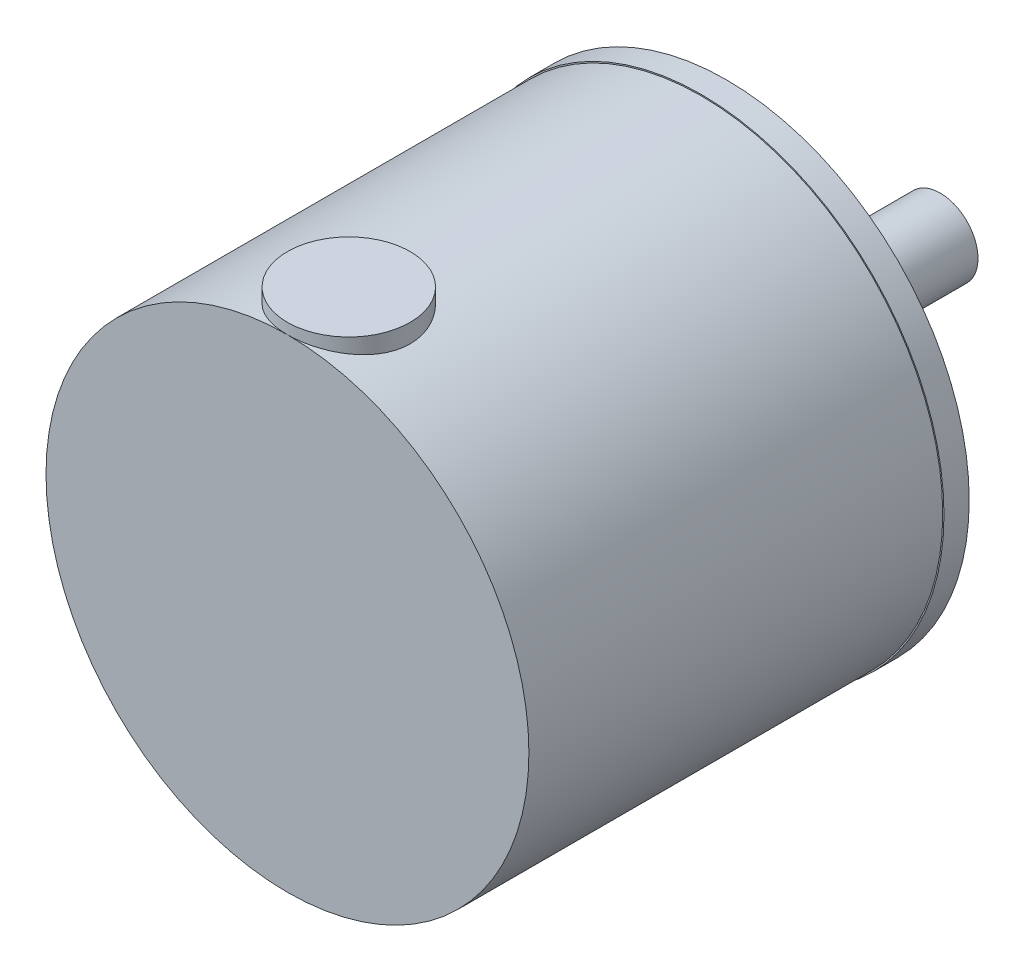
ISO-10303-21;
HEADER;
FILE_DESCRIPTION(('STEP AP214'),'2;1');
FILE_NAME('part.step','',(''),(''),'','','');
FILE_SCHEMA(('AUTOMOTIVE_DESIGN { 1 0 10303 214 1 1 1 1 }'));
ENDSEC;
DATA;
#1=APPLICATION_CONTEXT('core data for automotive mechanical design processes');
#2=APPLICATION_PROTOCOL_DEFINITION('international standard','automotive_design',2000,#1);
#3=PRODUCT_CONTEXT('',#1,'mechanical');
#4=PRODUCT('Part','Part','',(#3));
#5=PRODUCT_RELATED_PRODUCT_CATEGORY('part','',(#4));
#6=PRODUCT_DEFINITION_FORMATION('','',#4);
#7=PRODUCT_DEFINITION_CONTEXT('part definition',#1,'design');
#8=PRODUCT_DEFINITION('design','',#6,#7);
#9=PRODUCT_DEFINITION_SHAPE('','',#8);
#10=(LENGTH_UNIT() NAMED_UNIT(*) SI_UNIT(.MILLI.,.METRE.));
#11=(NAMED_UNIT(*) PLANE_ANGLE_UNIT() SI_UNIT($,.RADIAN.));
#12=(NAMED_UNIT(*) SI_UNIT($,.STERADIAN.) SOLID_ANGLE_UNIT());
#13=UNCERTAINTY_MEASURE_WITH_UNIT(LENGTH_MEASURE(1.E-05),#10,'distance_accuracy_value','');
#14=(GEOMETRIC_REPRESENTATION_CONTEXT(3) GLOBAL_UNCERTAINTY_ASSIGNED_CONTEXT((#13)) GLOBAL_UNIT_ASSIGNED_CONTEXT((#10,
#11,#12)) REPRESENTATION_CONTEXT('',''));
#15=CARTESIAN_POINT('',(0.,0.,0.));
#16=DIRECTION('',(0.,0.,1.));
#17=DIRECTION('',(1.,0.,0.));
#18=AXIS2_PLACEMENT_3D('',#15,#16,#17);
#19=CARTESIAN_POINT('',(0.,0.,0.));
#20=DIRECTION('',(0.,0.,1.));
#21=DIRECTION('',(1.,0.,0.));
#22=AXIS2_PLACEMENT_3D('',#19,#20,#21);
#23=PLANE('',#22);
#24=CARTESIAN_POINT('',(-13.6123028617707,4.79984834476713,0.));
#25=DIRECTION('',(0.,0.,-1.));
#26=DIRECTION('',(-1.,0.,0.));
#27=AXIS2_PLACEMENT_3D('',#24,#25,#26);
#28=CIRCLE('',#27,1.5);
#29=CARTESIAN_POINT('',(-15.1123028617707,4.79984834476713,0.));
#30=VERTEX_POINT('',#29);
#31=EDGE_CURVE('E140',#30,#30,#28,.T.);
#32=ORIENTED_EDGE('',*,*,#31,.F.);
#33=EDGE_LOOP('',(#32));
#34=FACE_BOUND('',#33,.T.);
#35=CARTESIAN_POINT('',(2.6493608300043,-14.1885242546846,0.));
#36=DIRECTION('',(0.,0.,-1.));
#37=DIRECTION('',(-1.,0.,0.));
#38=AXIS2_PLACEMENT_3D('',#35,#36,#37);
#39=CIRCLE('',#38,1.5);
#40=CARTESIAN_POINT('',(1.1493608300043,-14.1885242546846,0.));
#41=VERTEX_POINT('',#40);
#42=EDGE_CURVE('E144',#41,#41,#39,.T.);
#43=ORIENTED_EDGE('',*,*,#42,.F.);
#44=EDGE_LOOP('',(#43));
#45=FACE_BOUND('',#44,.T.);
#46=CARTESIAN_POINT('',(10.9629420317664,9.38867590991743,0.));
#47=DIRECTION('',(0.,0.,-1.));
#48=DIRECTION('',(-1.,0.,0.));
#49=AXIS2_PLACEMENT_3D('',#46,#47,#48);
#50=CIRCLE('',#49,1.5);
#51=CARTESIAN_POINT('',(9.46294203176636,9.38867590991743,0.));
#52=VERTEX_POINT('',#51);
#53=EDGE_CURVE('E148',#52,#52,#50,.T.);
#54=ORIENTED_EDGE('',*,*,#53,.F.);
#55=EDGE_LOOP('',(#54));
#56=FACE_BOUND('',#55,.T.);
#57=CARTESIAN_POINT('',(0.,0.,0.));
#58=DIRECTION('',(0.,0.,-1.));
#59=DIRECTION('',(-1.,0.,0.));
#60=AXIS2_PLACEMENT_3D('',#57,#58,#59);
#61=CIRCLE('',#60,9.975);
#62=CARTESIAN_POINT('',(9.975,0.,0.));
#63=VERTEX_POINT('',#62);
#64=EDGE_CURVE('E49',#63,#63,#61,.T.);
#65=ORIENTED_EDGE('',*,*,#64,.F.);
#66=EDGE_LOOP('',(#65));
#67=FACE_BOUND('',#66,.T.);
#68=CARTESIAN_POINT('',(0.,0.,0.));
#69=DIRECTION('',(0.,0.,-1.));
#70=DIRECTION('',(-1.,0.,0.));
#71=AXIS2_PLACEMENT_3D('',#68,#69,#70);
#72=CIRCLE('',#71,19.25);
#73=CARTESIAN_POINT('',(-19.25,0.,0.));
#74=VERTEX_POINT('',#73);
#75=EDGE_CURVE('E153',#74,#74,#72,.T.);
#76=ORIENTED_EDGE('',*,*,#75,.T.);
#77=EDGE_LOOP('',(#76));
#78=FACE_BOUND('',#77,.T.);
#79=ADVANCED_FACE('F40',(#34,#45,#56,#67,#78),#23,.F.);
#80=CARTESIAN_POINT('',(0.,0.,-4.95));
#81=DIRECTION('',(0.,0.,1.));
#82=DIRECTION('',(1.,0.,0.));
#83=AXIS2_PLACEMENT_3D('',#80,#81,#82);
#84=CYLINDRICAL_SURFACE('',#83,9.975);
#85=CARTESIAN_POINT('',(0.,0.,-4.95));
#86=DIRECTION('',(0.,0.,-1.));
#87=DIRECTION('',(-1.,0.,0.));
#88=AXIS2_PLACEMENT_3D('',#85,#86,#87);
#89=CIRCLE('',#88,9.975);
#90=CARTESIAN_POINT('',(9.975,0.,-4.95));
#91=VERTEX_POINT('',#90);
#92=EDGE_CURVE('E80',#91,#91,#89,.T.);
#93=CARTESIAN_POINT('',(9.975,0.,-4.95));
#94=CARTESIAN_POINT('',(9.975,0.,-4.8984375));
#95=CARTESIAN_POINT('',(9.975,0.,-4.846875));
#96=CARTESIAN_POINT('',(9.975,0.,-4.74375));
#97=CARTESIAN_POINT('',(9.975,0.,-4.6921875));
#98=CARTESIAN_POINT('',(9.975,0.,-4.5890625));
#99=CARTESIAN_POINT('',(9.975,0.,-4.5375));
#100=CARTESIAN_POINT('',(9.975,0.,-4.434375));
#101=CARTESIAN_POINT('',(9.975,0.,-4.3828125));
#102=CARTESIAN_POINT('',(9.975,0.,-4.2796875));
#103=CARTESIAN_POINT('',(9.975,0.,-4.228125));
#104=CARTESIAN_POINT('',(9.975,0.,-4.125));
#105=CARTESIAN_POINT('',(9.975,0.,-4.0734375));
#106=CARTESIAN_POINT('',(9.975,0.,-3.9703125));
#107=CARTESIAN_POINT('',(9.975,0.,-3.91875));
#108=CARTESIAN_POINT('',(9.975,0.,-3.815625));
#109=CARTESIAN_POINT('',(9.975,0.,-3.7640625));
#110=CARTESIAN_POINT('',(9.975,0.,-3.6609375));
#111=CARTESIAN_POINT('',(9.975,0.,-3.609375));
#112=CARTESIAN_POINT('',(9.975,0.,-3.50625));
#113=CARTESIAN_POINT('',(9.975,0.,-3.4546875));
#114=CARTESIAN_POINT('',(9.975,0.,-3.3515625));
#115=CARTESIAN_POINT('',(9.975,0.,-3.3));
#116=CARTESIAN_POINT('',(9.975,0.,-3.196875));
#117=CARTESIAN_POINT('',(9.975,0.,-3.1453125));
#118=CARTESIAN_POINT('',(9.975,0.,-3.0421875));
#119=CARTESIAN_POINT('',(9.975,0.,-2.990625));
#120=CARTESIAN_POINT('',(9.975,0.,-2.8875));
#121=CARTESIAN_POINT('',(9.975,0.,-2.8359375));
#122=CARTESIAN_POINT('',(9.975,0.,-2.7328125));
#123=CARTESIAN_POINT('',(9.975,0.,-2.68125));
#124=CARTESIAN_POINT('',(9.975,0.,-2.578125));
#125=CARTESIAN_POINT('',(9.975,0.,-2.5265625));
#126=CARTESIAN_POINT('',(9.975,0.,-2.4234375));
#127=CARTESIAN_POINT('',(9.975,0.,-2.371875));
#128=CARTESIAN_POINT('',(9.975,0.,-2.26875));
#129=CARTESIAN_POINT('',(9.975,0.,-2.2171875));
#130=CARTESIAN_POINT('',(9.975,0.,-2.1140625));
#131=CARTESIAN_POINT('',(9.975,0.,-2.0625));
#132=CARTESIAN_POINT('',(9.975,0.,-1.959375));
#133=CARTESIAN_POINT('',(9.975,0.,-1.9078125));
#134=CARTESIAN_POINT('',(9.975,0.,-1.8046875));
#135=CARTESIAN_POINT('',(9.975,0.,-1.753125));
#136=CARTESIAN_POINT('',(9.975,0.,-1.65));
#137=CARTESIAN_POINT('',(9.975,0.,-1.5984375));
#138=CARTESIAN_POINT('',(9.975,0.,-1.4953125));
#139=CARTESIAN_POINT('',(9.975,0.,-1.44375));
#140=CARTESIAN_POINT('',(9.975,0.,-1.340625));
#141=CARTESIAN_POINT('',(9.975,0.,-1.2890625));
#142=CARTESIAN_POINT('',(9.975,0.,-1.1859375));
#143=CARTESIAN_POINT('',(9.975,0.,-1.134375));
#144=CARTESIAN_POINT('',(9.975,0.,-1.03125));
#145=CARTESIAN_POINT('',(9.975,0.,-0.9796875));
#146=CARTESIAN_POINT('',(9.975,0.,-0.8765625));
#147=CARTESIAN_POINT('',(9.975,0.,-0.825));
#148=CARTESIAN_POINT('',(9.975,0.,-0.721875));
#149=CARTESIAN_POINT('',(9.975,0.,-0.6703125));
#150=CARTESIAN_POINT('',(9.975,0.,-0.5671875));
#151=CARTESIAN_POINT('',(9.975,0.,-0.515625));
#152=CARTESIAN_POINT('',(9.975,0.,-0.4125));
#153=CARTESIAN_POINT('',(9.975,0.,-0.3609375));
#154=CARTESIAN_POINT('',(9.975,0.,-0.2578125));
#155=CARTESIAN_POINT('',(9.975,0.,-0.20625));
#156=CARTESIAN_POINT('',(9.975,0.,-0.103125));
#157=CARTESIAN_POINT('',(9.975,0.,-0.0515625000000001));
#158=CARTESIAN_POINT('',(9.975,0.,0.));
#159=B_SPLINE_CURVE_WITH_KNOTS('',3,(#93,#94,#95,#96,#97,#98,#99,#100,#101,#102,#103,#104,#105,
#106,#107,#108,#109,#110,#111,#112,#113,#114,#115,#116,#117,#118,#119,#120,#121,#122,#123,#124,
#125,#126,#127,#128,#129,#130,#131,#132,#133,#134,#135,#136,#137,#138,#139,#140,#141,#142,#143,
#144,#145,#146,#147,#148,#149,#150,#151,#152,#153,#154,#155,#156,#157,#158),.UNSPECIFIED.,.F.,
.F.,(4,2,2,2,2,2,2,2,2,2,2,2,2,2,2,2,2,2,2,2,2,2,2,2,2,2,2,2,2,2,2,2,4),(0.,0.1546875,
0.309375000000001,0.4640625,0.61875,0.773437500000001,0.928125000000001,1.0828125,1.2375,
1.3921875,1.546875,1.7015625,1.85625,2.0109375,2.165625,2.3203125,2.475,2.6296875,2.784375,
2.9390625,3.09375,3.2484375,3.403125,3.5578125,3.7125,3.8671875,4.021875,4.1765625,4.33125,
4.4859375,4.640625,4.7953125,4.95),.UNSPECIFIED.);
#160=EDGE_CURVE('BSEAM127',#91,#63,#159,.T.);
#161=ORIENTED_EDGE('',*,*,#92,.F.);
#162=ORIENTED_EDGE('',*,*,#64,.T.);
#163=ORIENTED_EDGE('',*,*,#160,.T.);
#164=ORIENTED_EDGE('',*,*,#160,.F.);
#165=EDGE_LOOP('',(#161,#163,#162,#164));
#166=FACE_BOUND('',#165,.T.);
#167=ADVANCED_FACE('F127',(#166),#84,.T.);
#168=CARTESIAN_POINT('',(0.,0.,-4.95));
#169=DIRECTION('',(0.,0.,-1.));
#170=DIRECTION('',(-1.,0.,0.));
#171=AXIS2_PLACEMENT_3D('',#168,#169,#170);
#172=PLANE('',#171);
#173=CARTESIAN_POINT('',(0.,0.,-4.95));
#174=DIRECTION('',(0.,0.,-1.));
#175=DIRECTION('',(-1.,0.,0.));
#176=AXIS2_PLACEMENT_3D('',#173,#174,#175);
#177=CIRCLE('',#176,3.);
#178=CARTESIAN_POINT('',(-1.83932052671632,-2.37,-4.95));
#179=VERTEX_POINT('',#178);
#180=CARTESIAN_POINT('',(1.83932052671632,-2.37,-4.95));
#181=VERTEX_POINT('',#180);
#182=EDGE_CURVE('E70',#179,#181,#177,.T.);
#183=ORIENTED_EDGE('',*,*,#182,.F.);
#184=DIRECTION('',(-1.,0.,0.));
#185=VECTOR('',#184,1.);
#186=CARTESIAN_POINT('',(1.83932052671632,-2.37,-4.95));
#187=LINE('',#186,#185);
#188=EDGE_CURVE('E55',#181,#179,#187,.T.);
#189=ORIENTED_EDGE('',*,*,#188,.F.);
#190=EDGE_LOOP('',(#183,#189));
#191=FACE_BOUND('',#190,.T.);
#192=ORIENTED_EDGE('',*,*,#92,.T.);
#193=EDGE_LOOP('',(#192));
#194=FACE_BOUND('',#193,.T.);
#195=ADVANCED_FACE('F123',(#191,#194),#172,.T.);
#196=CARTESIAN_POINT('',(0.,0.,-16.95));
#197=DIRECTION('',(0.,0.,1.));
#198=DIRECTION('',(1.,0.,0.));
#199=AXIS2_PLACEMENT_3D('',#196,#197,#198);
#200=CYLINDRICAL_SURFACE('',#199,3.);
#201=ORIENTED_EDGE('',*,*,#182,.T.);
#202=DIRECTION('',(0.,0.,1.));
#203=VECTOR('',#202,1.);
#204=CARTESIAN_POINT('',(1.83932052671632,-2.37,-16.95));
#205=LINE('',#204,#203);
#206=CARTESIAN_POINT('',(1.83932052671632,-2.37,-16.95));
#207=VERTEX_POINT('',#206);
#208=EDGE_CURVE('E84',#207,#181,#205,.T.);
#209=ORIENTED_EDGE('',*,*,#208,.F.);
#210=CARTESIAN_POINT('',(0.,0.,-16.95));
#211=DIRECTION('',(0.,0.,-1.));
#212=DIRECTION('',(-1.,0.,0.));
#213=AXIS2_PLACEMENT_3D('',#210,#211,#212);
#214=CIRCLE('',#213,3.);
#215=CARTESIAN_POINT('',(-1.83932052671632,-2.37,-16.95));
#216=VERTEX_POINT('',#215);
#217=EDGE_CURVE('E92',#216,#207,#214,.T.);
#218=ORIENTED_EDGE('',*,*,#217,.F.);
#219=DIRECTION('',(0.,0.,1.));
#220=VECTOR('',#219,1.);
#221=CARTESIAN_POINT('',(-1.83932052671632,-2.37,-16.95));
#222=LINE('',#221,#220);
#223=EDGE_CURVE('E88',#216,#179,#222,.T.);
#224=ORIENTED_EDGE('',*,*,#223,.T.);
#225=EDGE_LOOP('',(#201,#209,#218,#224));
#226=FACE_BOUND('',#225,.T.);
#227=ADVANCED_FACE('F119',(#226),#200,.T.);
#228=CARTESIAN_POINT('',(1.83932052671632,-2.37,-16.95));
#229=DIRECTION('',(0.,1.,0.));
#230=DIRECTION('',(-1.,0.,0.));
#231=AXIS2_PLACEMENT_3D('',#228,#229,#230);
#232=PLANE('',#231);
#233=ORIENTED_EDGE('',*,*,#188,.T.);
#234=ORIENTED_EDGE('',*,*,#223,.F.);
#235=DIRECTION('',(-1.,0.,0.));
#236=VECTOR('',#235,1.);
#237=CARTESIAN_POINT('',(1.83932052671632,-2.37,-16.95));
#238=LINE('',#237,#236);
#239=EDGE_CURVE('E63',#207,#216,#238,.T.);
#240=ORIENTED_EDGE('',*,*,#239,.F.);
#241=ORIENTED_EDGE('',*,*,#208,.T.);
#242=EDGE_LOOP('',(#233,#234,#240,#241));
#243=FACE_BOUND('',#242,.T.);
#244=ADVANCED_FACE('F116',(#243),#232,.F.);
#245=CARTESIAN_POINT('',(0.,0.,-16.95));
#246=DIRECTION('',(0.,0.,-1.));
#247=DIRECTION('',(-1.,0.,0.));
#248=AXIS2_PLACEMENT_3D('',#245,#246,#247);
#249=PLANE('',#248);
#250=ORIENTED_EDGE('',*,*,#217,.T.);
#251=ORIENTED_EDGE('',*,*,#239,.T.);
#252=EDGE_LOOP('',(#250,#251));
#253=FACE_BOUND('',#252,.T.);
#254=ADVANCED_FACE('F112',(#253),#249,.T.);
#255=CARTESIAN_POINT('',(0.,0.,2.));
#256=DIRECTION('',(0.,0.,-1.));
#257=DIRECTION('',(-1.,0.,0.));
#258=AXIS2_PLACEMENT_3D('',#255,#256,#257);
#259=CYLINDRICAL_SURFACE('',#258,19.25);
#260=CARTESIAN_POINT('',(0.,0.,2.));
#261=DIRECTION('',(0.,0.,-1.));
#262=DIRECTION('',(-1.,0.,0.));
#263=AXIS2_PLACEMENT_3D('',#260,#261,#262);
#264=CIRCLE('',#263,19.25);
#265=CARTESIAN_POINT('',(-19.25,0.,2.));
#266=VERTEX_POINT('',#265);
#267=EDGE_CURVE('E155',#266,#266,#264,.T.);
#268=ORIENTED_EDGE('',*,*,#267,.T.);
#269=EDGE_LOOP('',(#268));
#270=FACE_BOUND('',#269,.T.);
#271=ORIENTED_EDGE('',*,*,#75,.F.);
#272=EDGE_LOOP('',(#271));
#273=FACE_BOUND('',#272,.T.);
#274=ADVANCED_FACE('F115',(#270,#273),#259,.T.);
#275=CARTESIAN_POINT('',(0.,0.,2.));
#276=DIRECTION('',(0.,0.,-1.));
#277=DIRECTION('',(-1.,0.,0.));
#278=AXIS2_PLACEMENT_3D('',#275,#276,#277);
#279=PLANE('',#278);
#280=CARTESIAN_POINT('',(0.,0.,2.));
#281=DIRECTION('',(0.,0.,-1.));
#282=DIRECTION('',(-1.,0.,0.));
#283=AXIS2_PLACEMENT_3D('',#280,#281,#282);
#284=CIRCLE('',#283,19.15);
#285=CARTESIAN_POINT('',(-19.15,0.,2.));
#286=VERTEX_POINT('',#285);
#287=EDGE_CURVE('E11',#286,#286,#284,.T.);
#288=ORIENTED_EDGE('',*,*,#287,.T.);
#289=EDGE_LOOP('',(#288));
#290=FACE_BOUND('',#289,.T.);
#291=ORIENTED_EDGE('',*,*,#267,.F.);
#292=EDGE_LOOP('',(#291));
#293=FACE_BOUND('',#292,.T.);
#294=ADVANCED_FACE('F199',(#290,#293),#279,.F.);
#295=CARTESIAN_POINT('',(0.,20.,29.955));
#296=DIRECTION('',(0.,1.,0.));
#297=DIRECTION('',(0.,0.,1.));
#298=AXIS2_PLACEMENT_3D('',#295,#296,#297);
#299=PLANE('',#298);
#300=CARTESIAN_POINT('',(0.,20.,29.955));
#301=DIRECTION('',(0.,1.,0.));
#302=DIRECTION('',(0.,0.,1.));
#303=AXIS2_PLACEMENT_3D('',#300,#301,#302);
#304=CIRCLE('',#303,4.865);
#305=CARTESIAN_POINT('',(0.,20.,34.82));
#306=VERTEX_POINT('',#305);
#307=EDGE_CURVE('E101',#306,#306,#304,.T.);
#308=ORIENTED_EDGE('',*,*,#307,.T.);
#309=EDGE_LOOP('',(#308));
#310=FACE_BOUND('',#309,.T.);
#311=ADVANCED_FACE('F109',(#310),#299,.T.);
#312=CARTESIAN_POINT('',(0.,20.,29.955));
#313=DIRECTION('',(0.,-1.,0.));
#314=DIRECTION('',(0.,0.,-1.));
#315=AXIS2_PLACEMENT_3D('',#312,#313,#314);
#316=CYLINDRICAL_SURFACE('',#315,4.865);
#317=ORIENTED_EDGE('',*,*,#307,.F.);
#318=EDGE_LOOP('',(#317));
#319=FACE_BOUND('',#318,.T.);
#320=CARTESIAN_POINT('',(0.,19.15,34.82));
#321=CARTESIAN_POINT('',(0.268652180400966,19.1499955575206,34.8199927222923));
#322=CARTESIAN_POINT('',(0.537384833791322,19.144290523315,34.797672167155));
#323=CARTESIAN_POINT('',(1.06713884716904,19.1220851073153,34.7091191629418));
#324=CARTESIAN_POINT('',(1.32815591215284,19.1055788268649,34.6428627198236));
#325=CARTESIAN_POINT('',(1.83475292159771,19.0635973197334,34.4687082230024));
#326=CARTESIAN_POINT('',(2.08035130572784,19.038133056618,34.3608610562185));
#327=CARTESIAN_POINT('',(2.54997135471119,18.9809425774671,34.1067678246473));
#328=CARTESIAN_POINT('',(2.7739921199023,18.9492161005014,33.9605201597273));
#329=CARTESIAN_POINT('',(3.19885019338595,18.8821884909482,33.6305006270705));
#330=CARTESIAN_POINT('',(3.3991645454761,18.8468307737705,33.44606698316));
#331=CARTESIAN_POINT('',(3.76637705982742,18.7768986205663,33.0463272245273));
#332=CARTESIAN_POINT('',(3.93327132783588,18.7423242762375,32.8310175170033));
#333=CARTESIAN_POINT('',(4.23138703973749,18.6773010771537,32.3715499705161));
#334=CARTESIAN_POINT('',(4.36201954624799,18.6469239539852,32.1269989357666));
#335=CARTESIAN_POINT('',(4.58011477607861,18.5945614333659,31.6185106486702));
#336=CARTESIAN_POINT('',(4.66758464950895,18.57257464615,31.3545766155435));
#337=CARTESIAN_POINT('',(4.79507998093654,18.5400644164016,30.8205748139682));
#338=CARTESIAN_POINT('',(4.836047614513,18.529313692262,30.5507461564549));
#339=CARTESIAN_POINT('',(4.87231091687609,18.5198128104812,30.0078481964221));
#340=CARTESIAN_POINT('',(4.86761427482692,18.5210606324683,29.7347794472186));
#341=CARTESIAN_POINT('',(4.81343317987546,18.5352117553355,29.2004049685693));
#342=CARTESIAN_POINT('',(4.76507551409785,18.5478218075705,28.9389760084453));
#343=CARTESIAN_POINT('',(4.62674425405019,18.5828086958656,28.4280687334049));
#344=CARTESIAN_POINT('',(4.5367676089773,18.6051862479077,28.1785912960528));
#345=CARTESIAN_POINT('',(4.31680230460489,18.6574532148777,27.6956674417077));
#346=CARTESIAN_POINT('',(4.1864080226058,18.6874181904955,27.4624143023167));
#347=CARTESIAN_POINT('',(3.88959236833135,18.7514415368815,27.0206972986849));
#348=CARTESIAN_POINT('',(3.72316450306753,18.7855006448897,26.8122379125998));
#349=CARTESIAN_POINT('',(3.35318718384463,18.8551060464731,26.4195731563481));
#350=CARTESIAN_POINT('',(3.1486879501837,18.8906665811273,26.2362640578745));
#351=CARTESIAN_POINT('',(2.71142316766114,18.9583637590837,25.9063684545815));
#352=CARTESIAN_POINT('',(2.47865669935736,18.9905002909502,25.7597831447439));
#353=CARTESIAN_POINT('',(1.99016015865176,19.0478971005322,25.5071516153352));
#354=CARTESIAN_POINT('',(1.73434957590598,19.0731319205839,25.4012549137228));
#355=CARTESIAN_POINT('',(1.20777248934048,19.1136971937324,25.2342198818652));
#356=CARTESIAN_POINT('',(0.937008953975575,19.1290296050343,25.173072702067));
#357=CARTESIAN_POINT('',(0.395871577255825,19.1477712204214,25.0986503633168));
#358=CARTESIAN_POINT('',(0.125675803388852,19.1514842264906,25.0841551434246));
#359=CARTESIAN_POINT('',(-0.413282011776418,19.1474358976081,25.1000964189811));
#360=CARTESIAN_POINT('',(-0.682044184295603,19.1396756315682,25.1305287287386));
#361=CARTESIAN_POINT('',(-1.20623870077727,19.1137477738023,25.2344566475831));
#362=CARTESIAN_POINT('',(-1.46181244026338,19.0957419919014,25.3072831185295));
#363=CARTESIAN_POINT('',(-1.95709968710083,19.0513554060368,25.4931647591326));
#364=CARTESIAN_POINT('',(-2.19681156008051,19.0249737406593,25.6062240666609));
#365=CARTESIAN_POINT('',(-2.65839786474257,18.9660378417246,25.8717023653467));
#366=CARTESIAN_POINT('',(-2.87986840215436,18.9333800353921,26.024800054844));
#367=CARTESIAN_POINT('',(-3.2944069323736,18.8656718592293,26.3651451513272));
#368=CARTESIAN_POINT('',(-3.48746984384662,18.8306210629971,26.5523986544551));
#369=CARTESIAN_POINT('',(-3.84476775593416,18.760977945473,26.9614120627339));
#370=CARTESIAN_POINT('',(-4.00814565820131,18.7264199009539,27.1839278244539));
#371=CARTESIAN_POINT('',(-4.29524591199024,18.6626652505506,27.6539337277761));
#372=CARTESIAN_POINT('',(-4.41897000795103,18.6334684088419,27.9014227701309));
#373=CARTESIAN_POINT('',(-4.62232453724505,18.5840676791304,28.4130388969586));
#374=CARTESIAN_POINT('',(-4.70221570541218,18.56381075733,28.6770569550071));
#375=CARTESIAN_POINT('',(-4.81630897248287,18.5345407953476,29.2153732263497));
#376=CARTESIAN_POINT('',(-4.85052145506026,18.5255251998192,29.4896690887144));
#377=CARTESIAN_POINT('',(-4.87173038614969,18.5199579302671,30.0320205816793));
#378=CARTESIAN_POINT('',(-4.86009849119483,18.523044157374,30.3000197005536));
#379=CARTESIAN_POINT('',(-4.79309820507646,18.5404930934621,30.8301005980891));
#380=CARTESIAN_POINT('',(-4.73773074909033,18.5548555613287,31.0921825031522));
#381=CARTESIAN_POINT('',(-4.58559137453985,18.5930335534482,31.6014423219284));
#382=CARTESIAN_POINT('',(-4.4890846573474,18.6167884601111,31.8487043220658));
#383=CARTESIAN_POINT('',(-4.25761488801411,18.6710815127403,32.3237066236705));
#384=CARTESIAN_POINT('',(-4.12264633122613,18.7016206295226,32.5514441247237));
#385=CARTESIAN_POINT('',(-3.81381798445432,18.7670669374528,32.9875419558038));
#386=CARTESIAN_POINT('',(-3.63901014601137,18.8020694916593,33.1952167078293));
#387=CARTESIAN_POINT('',(-3.25730235659579,18.8719384426324,33.5787306894507));
#388=CARTESIAN_POINT('',(-3.05039475641923,18.9068048049096,33.7545623092949));
#389=CARTESIAN_POINT('',(-2.60564836106239,18.9732584414332,34.0726406191104));
#390=CARTESIAN_POINT('',(-2.36729955253176,19.0047714208601,34.214190922797));
#391=CARTESIAN_POINT('',(-1.86940638400521,19.0601773264989,34.4549884302095));
#392=CARTESIAN_POINT('',(-1.60987699188345,19.0840755763027,34.5542652045112));
#393=CARTESIAN_POINT('',(-1.12577104968288,19.118130493141,34.6933820621915));
#394=CARTESIAN_POINT('',(-0.903450733298524,19.1299982961379,34.7407593755836));
#395=CARTESIAN_POINT('',(-0.454105856622085,19.1459346135608,34.8040701562058));
#396=CARTESIAN_POINT('',(-0.227081676042656,19.1500037550623,34.8200061515751));
#397=CARTESIAN_POINT('',(0.,19.15,34.82));
#398=B_SPLINE_CURVE_WITH_KNOTS('',3,(#320,#321,#322,#323,#324,#325,#326,#327,#328,#329,#330,
#331,#332,#333,#334,#335,#336,#337,#338,#339,#340,#341,#342,#343,#344,#345,#346,#347,#348,#349,
#350,#351,#352,#353,#354,#355,#356,#357,#358,#359,#360,#361,#362,#363,#364,#365,#366,#367,#368,
#369,#370,#371,#372,#373,#374,#375,#376,#377,#378,#379,#380,#381,#382,#383,#384,#385,#386,#387,
#388,#389,#390,#391,#392,#393,#394,#395,#396,#397),.UNSPECIFIED.,.T.,.F.,(4,2,2,2,2,2,2,2,2,2,2,
2,2,2,2,2,2,2,2,2,2,2,2,2,2,2,2,2,2,2,2,2,2,2,2,2,2,2,4),(0.,0.80512423013011,1.61068851309457,
2.41527028631907,3.21988559144905,4.03982916447288,4.85986822534165,5.69253579224163,
6.5250653771701,7.34040802159144,8.15561337718508,8.95036334054939,9.74517157083453,
10.5482297536793,11.3514327623524,12.1783163368816,13.005226814479,13.8351475139969,
14.6649040461011,15.472776254204,16.2805732013225,17.0759530977229,17.871414821104,
18.6813494759904,19.4914288300091,20.3220907609128,21.1527161445549,21.9783455539962,
22.8037872494774,23.6047221171625,24.4056398592894,25.2014708135838,25.9974157242225,
26.8147599500064,27.6322992446232,28.4652660968116,29.2976493229167,29.9782455572513,
30.6587870638478),.UNSPECIFIED.);
#399=CARTESIAN_POINT('',(0.,19.15,34.82));
#400=VERTEX_POINT('',#399);
#401=EDGE_CURVE('E78',#400,#400,#398,.T.);
#402=ORIENTED_EDGE('',*,*,#401,.T.);
#403=EDGE_LOOP('',(#402));
#404=FACE_BOUND('',#403,.T.);
#405=ADVANCED_FACE('F103',(#319,#404),#316,.T.);
#406=CARTESIAN_POINT('',(0.,0.,34.82));
#407=DIRECTION('',(0.,0.,1.));
#408=DIRECTION('',(1.,0.,0.));
#409=AXIS2_PLACEMENT_3D('',#406,#407,#408);
#410=PLANE('',#409);
#411=CARTESIAN_POINT('',(0.,0.,34.82));
#412=DIRECTION('',(0.,0.,1.));
#413=DIRECTION('',(1.,0.,0.));
#414=AXIS2_PLACEMENT_3D('',#411,#412,#413);
#415=CIRCLE('',#414,19.15);
#416=EDGE_CURVE('E75',#400,#400,#415,.T.);
#417=ORIENTED_EDGE('',*,*,#416,.T.);
#418=EDGE_LOOP('',(#417));
#419=FACE_BOUND('',#418,.T.);
#420=ADVANCED_FACE('F108',(#419),#410,.T.);
#421=CARTESIAN_POINT('',(0.,0.,34.82));
#422=DIRECTION('',(0.,0.,-1.));
#423=DIRECTION('',(-1.,0.,0.));
#424=AXIS2_PLACEMENT_3D('',#421,#422,#423);
#425=CYLINDRICAL_SURFACE('',#424,19.15);
#426=ORIENTED_EDGE('',*,*,#416,.F.);
#427=ORIENTED_EDGE('',*,*,#401,.F.);
#428=EDGE_LOOP('',(#426,#427));
#429=FACE_BOUND('',#428,.T.);
#430=ORIENTED_EDGE('',*,*,#287,.F.);
#431=EDGE_LOOP('',(#430));
#432=FACE_BOUND('',#431,.T.);
#433=ADVANCED_FACE('F42',(#429,#432),#425,.T.);
#434=CARTESIAN_POINT('',(10.9629420317664,9.38867590991743,5.));
#435=DIRECTION('',(0.,0.,-1.));
#436=DIRECTION('',(-1.,0.,0.));
#437=AXIS2_PLACEMENT_3D('',#434,#435,#436);
#438=CYLINDRICAL_SURFACE('',#437,1.5);
#439=CARTESIAN_POINT('',(10.9629420317664,9.38867590991743,5.));
#440=DIRECTION('',(0.,0.,-1.));
#441=DIRECTION('',(-1.,0.,0.));
#442=AXIS2_PLACEMENT_3D('',#439,#440,#441);
#443=CIRCLE('',#442,1.5);
#444=CARTESIAN_POINT('',(9.46294203176636,9.38867590991743,5.));
#445=VERTEX_POINT('',#444);
#446=EDGE_CURVE('E163',#445,#445,#443,.T.);
#447=ORIENTED_EDGE('',*,*,#446,.F.);
#448=EDGE_LOOP('',(#447));
#449=FACE_BOUND('',#448,.T.);
#450=ORIENTED_EDGE('',*,*,#53,.T.);
#451=EDGE_LOOP('',(#450));
#452=FACE_BOUND('',#451,.T.);
#453=ADVANCED_FACE('F194',(#449,#452),#438,.F.);
#454=CARTESIAN_POINT('',(10.9629420317664,9.38867590991743,5.));
#455=DIRECTION('',(0.,0.,-1.));
#456=DIRECTION('',(-1.,0.,0.));
#457=AXIS2_PLACEMENT_3D('',#454,#455,#456);
#458=PLANE('',#457);
#459=ORIENTED_EDGE('',*,*,#446,.T.);
#460=EDGE_LOOP('',(#459));
#461=FACE_BOUND('',#460,.T.);
#462=ADVANCED_FACE('F190',(#461),#458,.T.);
#463=CARTESIAN_POINT('',(2.6493608300043,-14.1885242546846,5.));
#464=DIRECTION('',(0.,0.,-1.));
#465=DIRECTION('',(-1.,0.,0.));
#466=AXIS2_PLACEMENT_3D('',#463,#464,#465);
#467=CYLINDRICAL_SURFACE('',#466,1.5);
#468=CARTESIAN_POINT('',(2.6493608300043,-14.1885242546846,5.));
#469=DIRECTION('',(0.,0.,-1.));
#470=DIRECTION('',(-1.,0.,0.));
#471=AXIS2_PLACEMENT_3D('',#468,#469,#470);
#472=CIRCLE('',#471,1.5);
#473=CARTESIAN_POINT('',(1.1493608300043,-14.1885242546846,5.));
#474=VERTEX_POINT('',#473);
#475=EDGE_CURVE('E167',#474,#474,#472,.T.);
#476=ORIENTED_EDGE('',*,*,#475,.F.);
#477=EDGE_LOOP('',(#476));
#478=FACE_BOUND('',#477,.T.);
#479=ORIENTED_EDGE('',*,*,#42,.T.);
#480=EDGE_LOOP('',(#479));
#481=FACE_BOUND('',#480,.T.);
#482=ADVANCED_FACE('F183',(#478,#481),#467,.F.);
#483=CARTESIAN_POINT('',(2.6493608300043,-14.1885242546846,5.));
#484=DIRECTION('',(0.,0.,-1.));
#485=DIRECTION('',(-1.,0.,0.));
#486=AXIS2_PLACEMENT_3D('',#483,#484,#485);
#487=PLANE('',#486);
#488=ORIENTED_EDGE('',*,*,#475,.T.);
#489=EDGE_LOOP('',(#488));
#490=FACE_BOUND('',#489,.T.);
#491=ADVANCED_FACE('F174',(#490),#487,.T.);
#492=CARTESIAN_POINT('',(-13.6123028617707,4.79984834476713,5.));
#493=DIRECTION('',(0.,0.,-1.));
#494=DIRECTION('',(-1.,0.,0.));
#495=AXIS2_PLACEMENT_3D('',#492,#493,#494);
#496=CYLINDRICAL_SURFACE('',#495,1.5);
#497=CARTESIAN_POINT('',(-13.6123028617707,4.79984834476713,5.));
#498=DIRECTION('',(0.,0.,-1.));
#499=DIRECTION('',(-1.,0.,0.));
#500=AXIS2_PLACEMENT_3D('',#497,#498,#499);
#501=CIRCLE('',#500,1.5);
#502=CARTESIAN_POINT('',(-15.1123028617707,4.79984834476713,5.));
#503=VERTEX_POINT('',#502);
#504=EDGE_CURVE('E156',#503,#503,#501,.T.);
#505=ORIENTED_EDGE('',*,*,#504,.F.);
#506=EDGE_LOOP('',(#505));
#507=FACE_BOUND('',#506,.T.);
#508=ORIENTED_EDGE('',*,*,#31,.T.);
#509=EDGE_LOOP('',(#508));
#510=FACE_BOUND('',#509,.T.);
#511=ADVANCED_FACE('F171',(#507,#510),#496,.F.);
#512=CARTESIAN_POINT('',(-13.6123028617707,4.79984834476713,5.));
#513=DIRECTION('',(0.,0.,-1.));
#514=DIRECTION('',(-1.,0.,0.));
#515=AXIS2_PLACEMENT_3D('',#512,#513,#514);
#516=PLANE('',#515);
#517=ORIENTED_EDGE('',*,*,#504,.T.);
#518=EDGE_LOOP('',(#517));
#519=FACE_BOUND('',#518,.T.);
#520=ADVANCED_FACE('F173',(#519),#516,.T.);
#521=CLOSED_SHELL('',(#79,#167,#195,#227,#244,#254,#274,#294,#311,#405,#420,#433,#453,#462,#482,
#491,#511,#520));
#522=MANIFOLD_SOLID_BREP('B2',#521);
#523=ADVANCED_BREP_SHAPE_REPRESENTATION('',(#18,#522),#14);
#524=SHAPE_DEFINITION_REPRESENTATION(#9,#523);
ENDSEC;
END-ISO-10303-21;
